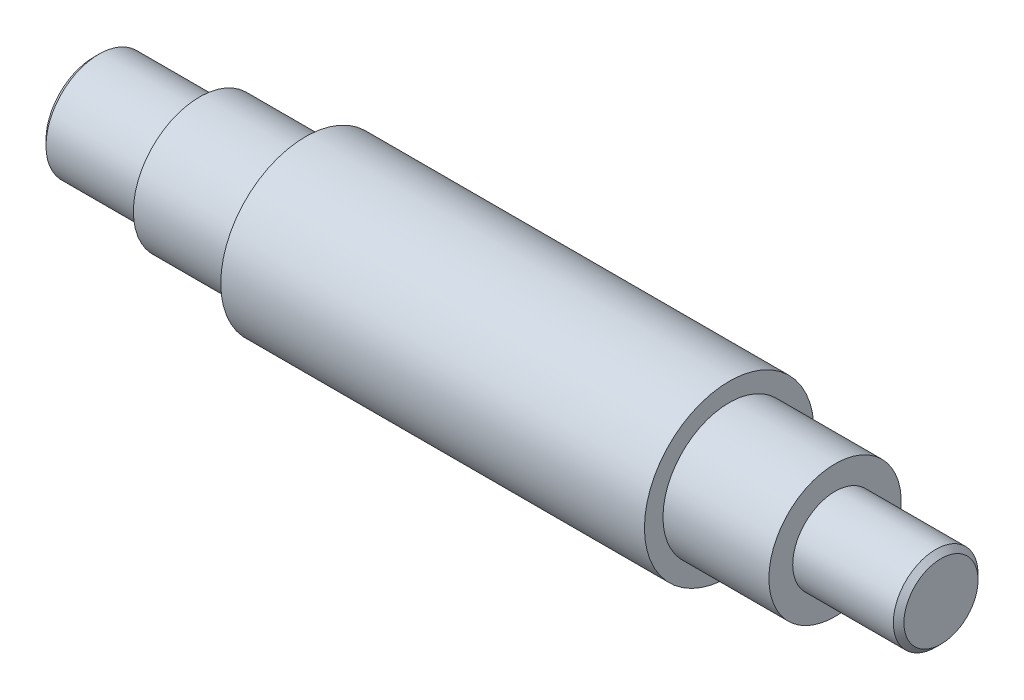
ISO-10303-21;
HEADER;
FILE_DESCRIPTION(('STEP AP214'),'2;1');
FILE_NAME('part.step','',(''),(''),'','','');
FILE_SCHEMA(('AUTOMOTIVE_DESIGN { 1 0 10303 214 1 1 1 1 }'));
ENDSEC;
DATA;
#1=APPLICATION_CONTEXT('core data for automotive mechanical design processes');
#2=APPLICATION_PROTOCOL_DEFINITION('international standard','automotive_design',2000,#1);
#3=PRODUCT_CONTEXT('',#1,'mechanical');
#4=PRODUCT('Part','Part','',(#3));
#5=PRODUCT_RELATED_PRODUCT_CATEGORY('part','',(#4));
#6=PRODUCT_DEFINITION_FORMATION('','',#4);
#7=PRODUCT_DEFINITION_CONTEXT('part definition',#1,'design');
#8=PRODUCT_DEFINITION('design','',#6,#7);
#9=PRODUCT_DEFINITION_SHAPE('','',#8);
#10=(LENGTH_UNIT() NAMED_UNIT(*) SI_UNIT(.MILLI.,.METRE.));
#11=(NAMED_UNIT(*) PLANE_ANGLE_UNIT() SI_UNIT($,.RADIAN.));
#12=(NAMED_UNIT(*) SI_UNIT($,.STERADIAN.) SOLID_ANGLE_UNIT());
#13=UNCERTAINTY_MEASURE_WITH_UNIT(LENGTH_MEASURE(1.E-05),#10,'distance_accuracy_value','');
#14=(GEOMETRIC_REPRESENTATION_CONTEXT(3) GLOBAL_UNCERTAINTY_ASSIGNED_CONTEXT((#13)) GLOBAL_UNIT_ASSIGNED_CONTEXT((#10,
#11,#12)) REPRESENTATION_CONTEXT('',''));
#15=CARTESIAN_POINT('',(0.,0.,0.));
#16=DIRECTION('',(0.,0.,1.));
#17=DIRECTION('',(1.,0.,0.));
#18=AXIS2_PLACEMENT_3D('',#15,#16,#17);
#19=CARTESIAN_POINT('',(0.,0.,0.));
#20=DIRECTION('',(1.,0.,0.));
#21=DIRECTION('',(0.,0.,-1.));
#22=AXIS2_PLACEMENT_3D('',#19,#20,#21);
#23=PLANE('',#22);
#24=CARTESIAN_POINT('',(0.,0.,0.));
#25=DIRECTION('',(-1.,0.,0.));
#26=DIRECTION('',(0.,0.,1.));
#27=AXIS2_PLACEMENT_3D('',#24,#25,#26);
#28=CIRCLE('',#27,9.);
#29=CARTESIAN_POINT('',(0.,0.,9.));
#30=VERTEX_POINT('',#29);
#31=EDGE_CURVE('E10',#30,#30,#28,.T.);
#32=ORIENTED_EDGE('',*,*,#31,.T.);
#33=EDGE_LOOP('',(#32));
#34=FACE_BOUND('',#33,.T.);
#35=ADVANCED_FACE('F40',(#34),#23,.F.);
#36=CARTESIAN_POINT('',(1.,0.,0.));
#37=DIRECTION('',(1.,0.,0.));
#38=DIRECTION('',(0.,0.,-1.));
#39=AXIS2_PLACEMENT_3D('',#36,#37,#38);
#40=CONICAL_SURFACE('',#39,10.,0.785398163397449);
#41=ORIENTED_EDGE('',*,*,#31,.F.);
#42=EDGE_LOOP('',(#41));
#43=FACE_BOUND('',#42,.T.);
#44=CARTESIAN_POINT('',(1.,0.,0.));
#45=DIRECTION('',(-1.,0.,0.));
#46=DIRECTION('',(0.,0.,1.));
#47=AXIS2_PLACEMENT_3D('',#44,#45,#46);
#48=CIRCLE('',#47,10.);
#49=CARTESIAN_POINT('',(1.,0.,10.));
#50=VERTEX_POINT('',#49);
#51=EDGE_CURVE('E43',#50,#50,#48,.T.);
#52=ORIENTED_EDGE('',*,*,#51,.T.);
#53=EDGE_LOOP('',(#52));
#54=FACE_BOUND('',#53,.T.);
#55=ADVANCED_FACE('F93',(#43,#54),#40,.T.);
#56=CARTESIAN_POINT('',(-5.,0.,0.));
#57=DIRECTION('',(-1.,0.,0.));
#58=DIRECTION('',(0.,0.,1.));
#59=AXIS2_PLACEMENT_3D('',#56,#57,#58);
#60=CYLINDRICAL_SURFACE('',#59,10.);
#61=ORIENTED_EDGE('',*,*,#51,.F.);
#62=EDGE_LOOP('',(#61));
#63=FACE_BOUND('',#62,.T.);
#64=CARTESIAN_POINT('',(20.,0.,0.));
#65=DIRECTION('',(-1.,0.,0.));
#66=DIRECTION('',(0.,0.,1.));
#67=AXIS2_PLACEMENT_3D('',#64,#65,#66);
#68=CIRCLE('',#67,10.);
#69=CARTESIAN_POINT('',(20.,0.,10.));
#70=VERTEX_POINT('',#69);
#71=EDGE_CURVE('E50',#70,#70,#68,.T.);
#72=ORIENTED_EDGE('',*,*,#71,.T.);
#73=EDGE_LOOP('',(#72));
#74=FACE_BOUND('',#73,.T.);
#75=ADVANCED_FACE('F100',(#63,#74),#60,.T.);
#76=CARTESIAN_POINT('',(20.,10.,0.));
#77=DIRECTION('',(1.,0.,0.));
#78=DIRECTION('',(0.,0.,-1.));
#79=AXIS2_PLACEMENT_3D('',#76,#77,#78);
#80=PLANE('',#79);
#81=ORIENTED_EDGE('',*,*,#71,.F.);
#82=EDGE_LOOP('',(#81));
#83=FACE_BOUND('',#82,.T.);
#84=CARTESIAN_POINT('',(20.,0.,0.));
#85=DIRECTION('',(-1.,0.,0.));
#86=DIRECTION('',(0.,0.,1.));
#87=AXIS2_PLACEMENT_3D('',#84,#85,#86);
#88=CIRCLE('',#87,12.5);
#89=CARTESIAN_POINT('',(20.,0.,12.5));
#90=VERTEX_POINT('',#89);
#91=EDGE_CURVE('E51',#90,#90,#88,.T.);
#92=ORIENTED_EDGE('',*,*,#91,.T.);
#93=EDGE_LOOP('',(#92));
#94=FACE_BOUND('',#93,.T.);
#95=ADVANCED_FACE('F105',(#83,#94),#80,.F.);
#96=CARTESIAN_POINT('',(-5.,0.,0.));
#97=DIRECTION('',(-1.,0.,0.));
#98=DIRECTION('',(0.,0.,1.));
#99=AXIS2_PLACEMENT_3D('',#96,#97,#98);
#100=CYLINDRICAL_SURFACE('',#99,12.5);
#101=ORIENTED_EDGE('',*,*,#91,.F.);
#102=EDGE_LOOP('',(#101));
#103=FACE_BOUND('',#102,.T.);
#104=CARTESIAN_POINT('',(40.,0.,0.));
#105=DIRECTION('',(-1.,0.,0.));
#106=DIRECTION('',(0.,0.,1.));
#107=AXIS2_PLACEMENT_3D('',#104,#105,#106);
#108=CIRCLE('',#107,12.5);
#109=CARTESIAN_POINT('',(40.,0.,12.5));
#110=VERTEX_POINT('',#109);
#111=EDGE_CURVE('E57',#110,#110,#108,.T.);
#112=ORIENTED_EDGE('',*,*,#111,.T.);
#113=EDGE_LOOP('',(#112));
#114=FACE_BOUND('',#113,.T.);
#115=ADVANCED_FACE('F109',(#103,#114),#100,.T.);
#116=CARTESIAN_POINT('',(40.,12.5,0.));
#117=DIRECTION('',(1.,0.,0.));
#118=DIRECTION('',(0.,0.,-1.));
#119=AXIS2_PLACEMENT_3D('',#116,#117,#118);
#120=PLANE('',#119);
#121=ORIENTED_EDGE('',*,*,#111,.F.);
#122=EDGE_LOOP('',(#121));
#123=FACE_BOUND('',#122,.T.);
#124=CARTESIAN_POINT('',(40.,0.,0.));
#125=DIRECTION('',(-1.,0.,0.));
#126=DIRECTION('',(0.,0.,1.));
#127=AXIS2_PLACEMENT_3D('',#124,#125,#126);
#128=CIRCLE('',#127,16.);
#129=CARTESIAN_POINT('',(40.,0.,16.));
#130=VERTEX_POINT('',#129);
#131=EDGE_CURVE('E56',#130,#130,#128,.T.);
#132=ORIENTED_EDGE('',*,*,#131,.T.);
#133=EDGE_LOOP('',(#132));
#134=FACE_BOUND('',#133,.T.);
#135=ADVANCED_FACE('F115',(#123,#134),#120,.F.);
#136=CARTESIAN_POINT('',(-5.,0.,0.));
#137=DIRECTION('',(-1.,0.,0.));
#138=DIRECTION('',(0.,0.,1.));
#139=AXIS2_PLACEMENT_3D('',#136,#137,#138);
#140=CYLINDRICAL_SURFACE('',#139,16.);
#141=ORIENTED_EDGE('',*,*,#131,.F.);
#142=EDGE_LOOP('',(#141));
#143=FACE_BOUND('',#142,.T.);
#144=CARTESIAN_POINT('',(120.,0.,0.));
#145=DIRECTION('',(-1.,0.,0.));
#146=DIRECTION('',(0.,0.,1.));
#147=AXIS2_PLACEMENT_3D('',#144,#145,#146);
#148=CIRCLE('',#147,16.);
#149=CARTESIAN_POINT('',(120.,0.,16.));
#150=VERTEX_POINT('',#149);
#151=EDGE_CURVE('E62',#150,#150,#148,.T.);
#152=ORIENTED_EDGE('',*,*,#151,.T.);
#153=EDGE_LOOP('',(#152));
#154=FACE_BOUND('',#153,.T.);
#155=ADVANCED_FACE('F116',(#143,#154),#140,.T.);
#156=CARTESIAN_POINT('',(120.,16.,0.));
#157=DIRECTION('',(-1.,0.,0.));
#158=DIRECTION('',(0.,0.,1.));
#159=AXIS2_PLACEMENT_3D('',#156,#157,#158);
#160=PLANE('',#159);
#161=ORIENTED_EDGE('',*,*,#151,.F.);
#162=EDGE_LOOP('',(#161));
#163=FACE_BOUND('',#162,.T.);
#164=CARTESIAN_POINT('',(120.,0.,0.));
#165=DIRECTION('',(-1.,0.,0.));
#166=DIRECTION('',(0.,0.,1.));
#167=AXIS2_PLACEMENT_3D('',#164,#165,#166);
#168=CIRCLE('',#167,12.5);
#169=CARTESIAN_POINT('',(120.,0.,12.5));
#170=VERTEX_POINT('',#169);
#171=EDGE_CURVE('E65',#170,#170,#168,.T.);
#172=ORIENTED_EDGE('',*,*,#171,.T.);
#173=EDGE_LOOP('',(#172));
#174=FACE_BOUND('',#173,.T.);
#175=ADVANCED_FACE('F120',(#163,#174),#160,.F.);
#176=CARTESIAN_POINT('',(-5.,0.,0.));
#177=DIRECTION('',(-1.,0.,0.));
#178=DIRECTION('',(0.,0.,1.));
#179=AXIS2_PLACEMENT_3D('',#176,#177,#178);
#180=CYLINDRICAL_SURFACE('',#179,12.5);
#181=ORIENTED_EDGE('',*,*,#171,.F.);
#182=EDGE_LOOP('',(#181));
#183=FACE_BOUND('',#182,.T.);
#184=CARTESIAN_POINT('',(140.,0.,0.));
#185=DIRECTION('',(-1.,0.,0.));
#186=DIRECTION('',(0.,0.,1.));
#187=AXIS2_PLACEMENT_3D('',#184,#185,#186);
#188=CIRCLE('',#187,12.5);
#189=CARTESIAN_POINT('',(140.,0.,12.5));
#190=VERTEX_POINT('',#189);
#191=EDGE_CURVE('E66',#190,#190,#188,.T.);
#192=ORIENTED_EDGE('',*,*,#191,.T.);
#193=EDGE_LOOP('',(#192));
#194=FACE_BOUND('',#193,.T.);
#195=ADVANCED_FACE('F125',(#183,#194),#180,.T.);
#196=CARTESIAN_POINT('',(140.,12.5,0.));
#197=DIRECTION('',(-1.,0.,0.));
#198=DIRECTION('',(0.,0.,1.));
#199=AXIS2_PLACEMENT_3D('',#196,#197,#198);
#200=PLANE('',#199);
#201=ORIENTED_EDGE('',*,*,#191,.F.);
#202=EDGE_LOOP('',(#201));
#203=FACE_BOUND('',#202,.T.);
#204=CARTESIAN_POINT('',(140.,0.,0.));
#205=DIRECTION('',(-1.,0.,0.));
#206=DIRECTION('',(0.,0.,1.));
#207=AXIS2_PLACEMENT_3D('',#204,#205,#206);
#208=CIRCLE('',#207,8.);
#209=CARTESIAN_POINT('',(140.,0.,8.));
#210=VERTEX_POINT('',#209);
#211=EDGE_CURVE('E71',#210,#210,#208,.T.);
#212=ORIENTED_EDGE('',*,*,#211,.T.);
#213=EDGE_LOOP('',(#212));
#214=FACE_BOUND('',#213,.T.);
#215=ADVANCED_FACE('F126',(#203,#214),#200,.F.);
#216=CARTESIAN_POINT('',(-5.,0.,0.));
#217=DIRECTION('',(-1.,0.,0.));
#218=DIRECTION('',(0.,0.,1.));
#219=AXIS2_PLACEMENT_3D('',#216,#217,#218);
#220=CYLINDRICAL_SURFACE('',#219,8.);
#221=ORIENTED_EDGE('',*,*,#211,.F.);
#222=EDGE_LOOP('',(#221));
#223=FACE_BOUND('',#222,.T.);
#224=CARTESIAN_POINT('',(159.,0.,0.));
#225=DIRECTION('',(-1.,0.,0.));
#226=DIRECTION('',(0.,0.,1.));
#227=AXIS2_PLACEMENT_3D('',#224,#225,#226);
#228=CIRCLE('',#227,8.);
#229=CARTESIAN_POINT('',(159.,0.,8.));
#230=VERTEX_POINT('',#229);
#231=EDGE_CURVE('E73',#230,#230,#228,.T.);
#232=ORIENTED_EDGE('',*,*,#231,.T.);
#233=EDGE_LOOP('',(#232));
#234=FACE_BOUND('',#233,.T.);
#235=ADVANCED_FACE('F87',(#223,#234),#220,.T.);
#236=CARTESIAN_POINT('',(160.,0.,0.));
#237=DIRECTION('',(-1.,0.,0.));
#238=DIRECTION('',(0.,0.,1.));
#239=AXIS2_PLACEMENT_3D('',#236,#237,#238);
#240=CONICAL_SURFACE('',#239,7.,0.785398163397448);
#241=ORIENTED_EDGE('',*,*,#231,.F.);
#242=EDGE_LOOP('',(#241));
#243=FACE_BOUND('',#242,.T.);
#244=CARTESIAN_POINT('',(160.,0.,0.));
#245=DIRECTION('',(-1.,0.,0.));
#246=DIRECTION('',(0.,0.,1.));
#247=AXIS2_PLACEMENT_3D('',#244,#245,#246);
#248=CIRCLE('',#247,7.);
#249=CARTESIAN_POINT('',(160.,0.,7.));
#250=VERTEX_POINT('',#249);
#251=EDGE_CURVE('E77',#250,#250,#248,.T.);
#252=ORIENTED_EDGE('',*,*,#251,.T.);
#253=EDGE_LOOP('',(#252));
#254=FACE_BOUND('',#253,.T.);
#255=ADVANCED_FACE('F83',(#243,#254),#240,.T.);
#256=CARTESIAN_POINT('',(160.,7.,0.));
#257=DIRECTION('',(-1.,0.,0.));
#258=DIRECTION('',(0.,0.,1.));
#259=AXIS2_PLACEMENT_3D('',#256,#257,#258);
#260=PLANE('',#259);
#261=ORIENTED_EDGE('',*,*,#251,.F.);
#262=EDGE_LOOP('',(#261));
#263=FACE_BOUND('',#262,.T.);
#264=ADVANCED_FACE('F81',(#263),#260,.F.);
#265=CLOSED_SHELL('',(#35,#55,#75,#95,#115,#135,#155,#175,#195,#215,#235,#255,#264));
#266=MANIFOLD_SOLID_BREP('B2',#265);
#267=ADVANCED_BREP_SHAPE_REPRESENTATION('',(#18,#266),#14);
#268=SHAPE_DEFINITION_REPRESENTATION(#9,#267);
ENDSEC;
END-ISO-10303-21;
